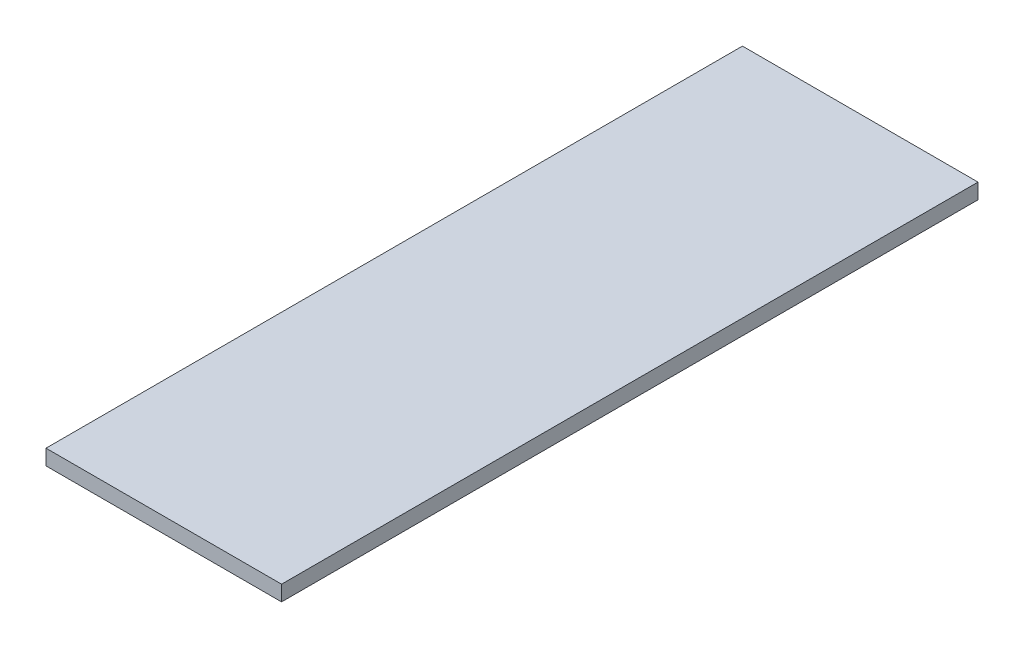
ISO-10303-21;
HEADER;
FILE_DESCRIPTION(('STEP AP214'),'2;1');
FILE_NAME('part.step','',(''),(''),'','','');
FILE_SCHEMA(('AUTOMOTIVE_DESIGN { 1 0 10303 214 1 1 1 1 }'));
ENDSEC;
DATA;
#1=APPLICATION_CONTEXT('core data for automotive mechanical design processes');
#2=APPLICATION_PROTOCOL_DEFINITION('international standard','automotive_design',2000,#1);
#3=PRODUCT_CONTEXT('',#1,'mechanical');
#4=PRODUCT('Part','Part','',(#3));
#5=PRODUCT_RELATED_PRODUCT_CATEGORY('part','',(#4));
#6=PRODUCT_DEFINITION_FORMATION('','',#4);
#7=PRODUCT_DEFINITION_CONTEXT('part definition',#1,'design');
#8=PRODUCT_DEFINITION('design','',#6,#7);
#9=PRODUCT_DEFINITION_SHAPE('','',#8);
#10=(LENGTH_UNIT() NAMED_UNIT(*) SI_UNIT(.MILLI.,.METRE.));
#11=(NAMED_UNIT(*) PLANE_ANGLE_UNIT() SI_UNIT($,.RADIAN.));
#12=(NAMED_UNIT(*) SI_UNIT($,.STERADIAN.) SOLID_ANGLE_UNIT());
#13=UNCERTAINTY_MEASURE_WITH_UNIT(LENGTH_MEASURE(1.E-05),#10,'distance_accuracy_value','');
#14=(GEOMETRIC_REPRESENTATION_CONTEXT(3) GLOBAL_UNCERTAINTY_ASSIGNED_CONTEXT((#13)) GLOBAL_UNIT_ASSIGNED_CONTEXT((#10,
#11,#12)) REPRESENTATION_CONTEXT('',''));
#15=CARTESIAN_POINT('',(0.,0.,0.));
#16=DIRECTION('',(0.,0.,1.));
#17=DIRECTION('',(1.,0.,0.));
#18=AXIS2_PLACEMENT_3D('',#15,#16,#17);
#19=CARTESIAN_POINT('',(-113.672239263804,4.125,-146.504141104294));
#20=DIRECTION('',(1.,0.,0.));
#21=DIRECTION('',(0.,0.,-1.));
#22=AXIS2_PLACEMENT_3D('',#19,#20,#21);
#23=PLANE('',#22);
#24=DIRECTION('',(0.,0.,1.));
#25=VECTOR('',#24,1.);
#26=CARTESIAN_POINT('',(-113.672239263804,-3.375,-146.504141104294));
#27=LINE('',#26,#25);
#28=CARTESIAN_POINT('',(-113.672239263804,-3.375,-146.504141104294));
#29=VERTEX_POINT('',#28);
#30=CARTESIAN_POINT('',(-113.672239263804,-3.375,193.495858895706));
#31=VERTEX_POINT('',#30);
#32=EDGE_CURVE('E98',#29,#31,#27,.T.);
#33=ORIENTED_EDGE('',*,*,#32,.T.);
#34=DIRECTION('',(0.,-1.,0.));
#35=VECTOR('',#34,1.);
#36=CARTESIAN_POINT('',(-113.672239263804,4.125,193.495858895706));
#37=LINE('',#36,#35);
#38=CARTESIAN_POINT('',(-113.672239263804,4.125,193.495858895706));
#39=VERTEX_POINT('',#38);
#40=EDGE_CURVE('E11',#39,#31,#37,.T.);
#41=ORIENTED_EDGE('',*,*,#40,.F.);
#42=DIRECTION('',(0.,0.,1.));
#43=VECTOR('',#42,1.);
#44=CARTESIAN_POINT('',(-113.672239263804,4.125,-146.504141104294));
#45=LINE('',#44,#43);
#46=CARTESIAN_POINT('',(-113.672239263804,4.125,-146.504141104294));
#47=VERTEX_POINT('',#46);
#48=EDGE_CURVE('E86',#47,#39,#45,.T.);
#49=ORIENTED_EDGE('',*,*,#48,.F.);
#50=DIRECTION('',(0.,-1.,0.));
#51=VECTOR('',#50,1.);
#52=CARTESIAN_POINT('',(-113.672239263804,4.125,-146.504141104294));
#53=LINE('',#52,#51);
#54=EDGE_CURVE('E94',#47,#29,#53,.T.);
#55=ORIENTED_EDGE('',*,*,#54,.T.);
#56=EDGE_LOOP('',(#33,#41,#49,#55));
#57=FACE_BOUND('',#56,.T.);
#58=ADVANCED_FACE('F35',(#57),#23,.F.);
#59=CARTESIAN_POINT('',(-113.672239263804,4.125,193.495858895706));
#60=DIRECTION('',(0.,0.,-1.));
#61=DIRECTION('',(-1.,0.,0.));
#62=AXIS2_PLACEMENT_3D('',#59,#60,#61);
#63=PLANE('',#62);
#64=DIRECTION('',(1.,0.,0.));
#65=VECTOR('',#64,1.);
#66=CARTESIAN_POINT('',(-113.672239263804,-3.375,193.495858895706));
#67=LINE('',#66,#65);
#68=CARTESIAN_POINT('',(1.32776073619618,-3.375,193.495858895706));
#69=VERTEX_POINT('',#68);
#70=EDGE_CURVE('E90',#31,#69,#67,.T.);
#71=ORIENTED_EDGE('',*,*,#70,.T.);
#72=DIRECTION('',(0.,-1.,0.));
#73=VECTOR('',#72,1.);
#74=CARTESIAN_POINT('',(1.32776073619618,4.125,193.495858895706));
#75=LINE('',#74,#73);
#76=CARTESIAN_POINT('',(1.32776073619618,4.125,193.495858895706));
#77=VERTEX_POINT('',#76);
#78=EDGE_CURVE('E43',#77,#69,#75,.T.);
#79=ORIENTED_EDGE('',*,*,#78,.F.);
#80=DIRECTION('',(1.,0.,0.));
#81=VECTOR('',#80,1.);
#82=CARTESIAN_POINT('',(-113.672239263804,4.125,193.495858895706));
#83=LINE('',#82,#81);
#84=EDGE_CURVE('E81',#39,#77,#83,.T.);
#85=ORIENTED_EDGE('',*,*,#84,.F.);
#86=ORIENTED_EDGE('',*,*,#40,.T.);
#87=EDGE_LOOP('',(#71,#79,#85,#86));
#88=FACE_BOUND('',#87,.T.);
#89=ADVANCED_FACE('F89',(#88),#63,.F.);
#90=CARTESIAN_POINT('',(1.32776073619625,4.125,-146.504141104294));
#91=DIRECTION('',(-1.,0.,0.));
#92=DIRECTION('',(0.,0.,1.));
#93=AXIS2_PLACEMENT_3D('',#90,#91,#92);
#94=PLANE('',#93);
#95=DIRECTION('',(0.,0.,-1.));
#96=VECTOR('',#95,1.);
#97=CARTESIAN_POINT('',(1.32776073619625,-3.375,-146.504141104294));
#98=LINE('',#97,#96);
#99=CARTESIAN_POINT('',(1.32776073619625,-3.375,-146.504141104294));
#100=VERTEX_POINT('',#99);
#101=EDGE_CURVE('E68',#69,#100,#98,.T.);
#102=ORIENTED_EDGE('',*,*,#101,.T.);
#103=DIRECTION('',(0.,-1.,0.));
#104=VECTOR('',#103,1.);
#105=CARTESIAN_POINT('',(1.32776073619625,4.125,-146.504141104294));
#106=LINE('',#105,#104);
#107=CARTESIAN_POINT('',(1.32776073619625,4.125,-146.504141104294));
#108=VERTEX_POINT('',#107);
#109=EDGE_CURVE('E91',#108,#100,#106,.T.);
#110=ORIENTED_EDGE('',*,*,#109,.F.);
#111=DIRECTION('',(0.,0.,-1.));
#112=VECTOR('',#111,1.);
#113=CARTESIAN_POINT('',(1.32776073619625,4.125,-146.504141104294));
#114=LINE('',#113,#112);
#115=EDGE_CURVE('E84',#77,#108,#114,.T.);
#116=ORIENTED_EDGE('',*,*,#115,.F.);
#117=ORIENTED_EDGE('',*,*,#78,.T.);
#118=EDGE_LOOP('',(#102,#110,#116,#117));
#119=FACE_BOUND('',#118,.T.);
#120=ADVANCED_FACE('F92',(#119),#94,.F.);
#121=CARTESIAN_POINT('',(-113.672239263804,4.125,-146.504141104294));
#122=DIRECTION('',(0.,0.,1.));
#123=DIRECTION('',(1.,0.,0.));
#124=AXIS2_PLACEMENT_3D('',#121,#122,#123);
#125=PLANE('',#124);
#126=DIRECTION('',(-1.,0.,0.));
#127=VECTOR('',#126,1.);
#128=CARTESIAN_POINT('',(-113.672239263804,-3.375,-146.504141104294));
#129=LINE('',#128,#127);
#130=EDGE_CURVE('E74',#100,#29,#129,.T.);
#131=ORIENTED_EDGE('',*,*,#130,.T.);
#132=ORIENTED_EDGE('',*,*,#54,.F.);
#133=DIRECTION('',(-1.,0.,0.));
#134=VECTOR('',#133,1.);
#135=CARTESIAN_POINT('',(-113.672239263804,4.125,-146.504141104294));
#136=LINE('',#135,#134);
#137=EDGE_CURVE('E51',#108,#47,#136,.T.);
#138=ORIENTED_EDGE('',*,*,#137,.F.);
#139=ORIENTED_EDGE('',*,*,#109,.T.);
#140=EDGE_LOOP('',(#131,#132,#138,#139));
#141=FACE_BOUND('',#140,.T.);
#142=ADVANCED_FACE('F105',(#141),#125,.F.);
#143=CARTESIAN_POINT('',(505.550153374233,4.125,-211.46273006135));
#144=DIRECTION('',(0.,1.,0.));
#145=DIRECTION('',(0.,0.,1.));
#146=AXIS2_PLACEMENT_3D('',#143,#144,#145);
#147=PLANE('',#146);
#148=ORIENTED_EDGE('',*,*,#48,.T.);
#149=ORIENTED_EDGE('',*,*,#84,.T.);
#150=ORIENTED_EDGE('',*,*,#115,.T.);
#151=ORIENTED_EDGE('',*,*,#137,.T.);
#152=EDGE_LOOP('',(#148,#149,#150,#151));
#153=FACE_BOUND('',#152,.T.);
#154=ADVANCED_FACE('F82',(#153),#147,.T.);
#155=CARTESIAN_POINT('',(505.550153374233,-3.375,-211.46273006135));
#156=DIRECTION('',(0.,1.,0.));
#157=DIRECTION('',(0.,0.,1.));
#158=AXIS2_PLACEMENT_3D('',#155,#156,#157);
#159=PLANE('',#158);
#160=ORIENTED_EDGE('',*,*,#32,.F.);
#161=ORIENTED_EDGE('',*,*,#130,.F.);
#162=ORIENTED_EDGE('',*,*,#101,.F.);
#163=ORIENTED_EDGE('',*,*,#70,.F.);
#164=EDGE_LOOP('',(#160,#161,#162,#163));
#165=FACE_BOUND('',#164,.T.);
#166=ADVANCED_FACE('F108',(#165),#159,.F.);
#167=CLOSED_SHELL('',(#58,#89,#120,#142,#154,#166));
#168=MANIFOLD_SOLID_BREP('B2',#167);
#169=ADVANCED_BREP_SHAPE_REPRESENTATION('',(#18,#168),#14);
#170=SHAPE_DEFINITION_REPRESENTATION(#9,#169);
ENDSEC;
END-ISO-10303-21;
